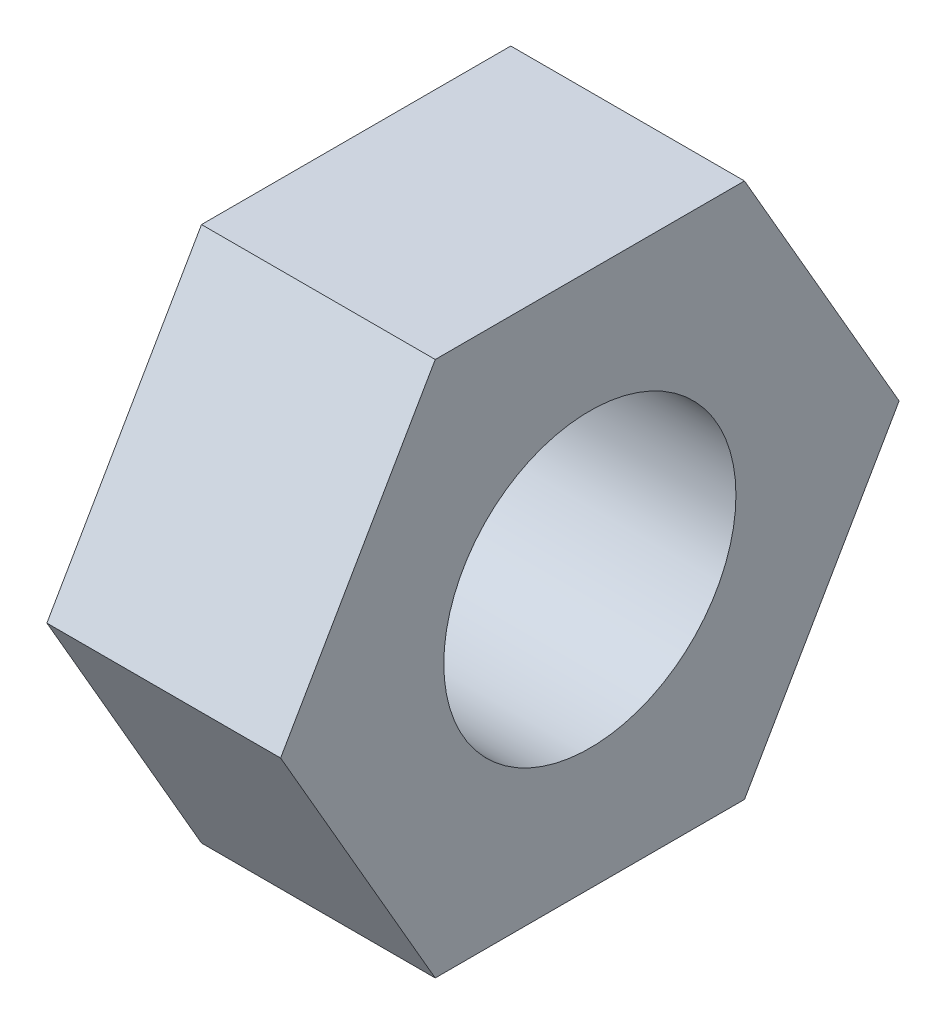
ISO-10303-21;
HEADER;
FILE_DESCRIPTION(('STEP AP214'),'2;1');
FILE_NAME('part.step','',(''),(''),'','','');
FILE_SCHEMA(('AUTOMOTIVE_DESIGN { 1 0 10303 214 1 1 1 1 }'));
ENDSEC;
DATA;
#1=APPLICATION_CONTEXT('core data for automotive mechanical design processes');
#2=APPLICATION_PROTOCOL_DEFINITION('international standard','automotive_design',2000,#1);
#3=PRODUCT_CONTEXT('',#1,'mechanical');
#4=PRODUCT('Part','Part','',(#3));
#5=PRODUCT_RELATED_PRODUCT_CATEGORY('part','',(#4));
#6=PRODUCT_DEFINITION_FORMATION('','',#4);
#7=PRODUCT_DEFINITION_CONTEXT('part definition',#1,'design');
#8=PRODUCT_DEFINITION('design','',#6,#7);
#9=PRODUCT_DEFINITION_SHAPE('','',#8);
#10=(LENGTH_UNIT() NAMED_UNIT(*) SI_UNIT(.MILLI.,.METRE.));
#11=(NAMED_UNIT(*) PLANE_ANGLE_UNIT() SI_UNIT($,.RADIAN.));
#12=(NAMED_UNIT(*) SI_UNIT($,.STERADIAN.) SOLID_ANGLE_UNIT());
#13=UNCERTAINTY_MEASURE_WITH_UNIT(LENGTH_MEASURE(1.E-05),#10,'distance_accuracy_value','');
#14=(GEOMETRIC_REPRESENTATION_CONTEXT(3) GLOBAL_UNCERTAINTY_ASSIGNED_CONTEXT((#13)) GLOBAL_UNIT_ASSIGNED_CONTEXT((#10,
#11,#12)) REPRESENTATION_CONTEXT('',''));
#15=CARTESIAN_POINT('',(0.,0.,0.));
#16=DIRECTION('',(0.,0.,1.));
#17=DIRECTION('',(1.,0.,0.));
#18=AXIS2_PLACEMENT_3D('',#15,#16,#17);
#19=CARTESIAN_POINT('',(2.4,0.,0.));
#20=DIRECTION('',(1.,0.,0.));
#21=DIRECTION('',(0.,0.,-1.));
#22=AXIS2_PLACEMENT_3D('',#19,#20,#21);
#23=PLANE('',#22);
#24=DIRECTION('',(0.,0.866025403784439,-0.5));
#25=VECTOR('',#24,1.);
#26=CARTESIAN_POINT('',(2.4,-2.75,-1.58771324027147));
#27=LINE('',#26,#25);
#28=CARTESIAN_POINT('',(2.4,-2.75,-1.58771324027147));
#29=VERTEX_POINT('',#28);
#30=CARTESIAN_POINT('',(2.4,0.,-3.17542648054294));
#31=VERTEX_POINT('',#30);
#32=EDGE_CURVE('E129',#29,#31,#27,.T.);
#33=ORIENTED_EDGE('',*,*,#32,.T.);
#34=DIRECTION('',(0.,0.866025403784438,0.5));
#35=VECTOR('',#34,1.);
#36=CARTESIAN_POINT('',(2.4,0.,-3.17542648054294));
#37=LINE('',#36,#35);
#38=CARTESIAN_POINT('',(2.4,2.75,-1.58771324027147));
#39=VERTEX_POINT('',#38);
#40=EDGE_CURVE('E87',#31,#39,#37,.T.);
#41=ORIENTED_EDGE('',*,*,#40,.T.);
#42=DIRECTION('',(0.,0.,1.));
#43=VECTOR('',#42,1.);
#44=CARTESIAN_POINT('',(2.4,2.75,-1.58771324027147));
#45=LINE('',#44,#43);
#46=CARTESIAN_POINT('',(2.4,2.75,1.58771324027147));
#47=VERTEX_POINT('',#46);
#48=EDGE_CURVE('E100',#39,#47,#45,.T.);
#49=ORIENTED_EDGE('',*,*,#48,.T.);
#50=DIRECTION('',(0.,-0.866025403784439,0.5));
#51=VECTOR('',#50,1.);
#52=CARTESIAN_POINT('',(2.4,2.75,1.58771324027147));
#53=LINE('',#52,#51);
#54=CARTESIAN_POINT('',(2.4,0.,3.17542648054294));
#55=VERTEX_POINT('',#54);
#56=EDGE_CURVE('E94',#47,#55,#53,.T.);
#57=ORIENTED_EDGE('',*,*,#56,.T.);
#58=DIRECTION('',(0.,-0.866025403784439,-0.5));
#59=VECTOR('',#58,1.);
#60=CARTESIAN_POINT('',(2.4,0.,3.17542648054294));
#61=LINE('',#60,#59);
#62=CARTESIAN_POINT('',(2.4,-2.75,1.58771324027147));
#63=VERTEX_POINT('',#62);
#64=EDGE_CURVE('E98',#55,#63,#61,.T.);
#65=ORIENTED_EDGE('',*,*,#64,.T.);
#66=DIRECTION('',(0.,0.,-1.));
#67=VECTOR('',#66,1.);
#68=CARTESIAN_POINT('',(2.4,-2.75,1.58771324027147));
#69=LINE('',#68,#67);
#70=EDGE_CURVE('E50',#63,#29,#69,.T.);
#71=ORIENTED_EDGE('',*,*,#70,.T.);
#72=EDGE_LOOP('',(#33,#41,#49,#57,#65,#71));
#73=FACE_BOUND('',#72,.T.);
#74=CARTESIAN_POINT('',(2.4,0.,0.));
#75=DIRECTION('',(1.,0.,0.));
#76=DIRECTION('',(0.,0.,-1.));
#77=AXIS2_PLACEMENT_3D('',#74,#75,#76);
#78=CIRCLE('',#77,1.5);
#79=CARTESIAN_POINT('',(2.4,0.,-1.5));
#80=VERTEX_POINT('',#79);
#81=EDGE_CURVE('E122',#80,#80,#78,.T.);
#82=ORIENTED_EDGE('',*,*,#81,.F.);
#83=EDGE_LOOP('',(#82));
#84=FACE_BOUND('',#83,.T.);
#85=ADVANCED_FACE('F33',(#73,#84),#23,.T.);
#86=CARTESIAN_POINT('',(0.,0.,0.));
#87=DIRECTION('',(1.,0.,0.));
#88=DIRECTION('',(0.,0.,-1.));
#89=AXIS2_PLACEMENT_3D('',#86,#87,#88);
#90=PLANE('',#89);
#91=DIRECTION('',(0.,0.866025403784439,-0.5));
#92=VECTOR('',#91,1.);
#93=CARTESIAN_POINT('',(0.,-2.75,-1.58771324027147));
#94=LINE('',#93,#92);
#95=CARTESIAN_POINT('',(0.,-2.75,-1.58771324027147));
#96=VERTEX_POINT('',#95);
#97=CARTESIAN_POINT('',(0.,0.,-3.17542648054294));
#98=VERTEX_POINT('',#97);
#99=EDGE_CURVE('E118',#96,#98,#94,.T.);
#100=ORIENTED_EDGE('',*,*,#99,.F.);
#101=DIRECTION('',(0.,0.,-1.));
#102=VECTOR('',#101,1.);
#103=CARTESIAN_POINT('',(0.,-2.75,1.58771324027147));
#104=LINE('',#103,#102);
#105=CARTESIAN_POINT('',(0.,-2.75,1.58771324027147));
#106=VERTEX_POINT('',#105);
#107=EDGE_CURVE('E79',#106,#96,#104,.T.);
#108=ORIENTED_EDGE('',*,*,#107,.F.);
#109=DIRECTION('',(0.,-0.866025403784439,-0.5));
#110=VECTOR('',#109,1.);
#111=CARTESIAN_POINT('',(0.,0.,3.17542648054294));
#112=LINE('',#111,#110);
#113=CARTESIAN_POINT('',(0.,0.,3.17542648054294));
#114=VERTEX_POINT('',#113);
#115=EDGE_CURVE('E73',#114,#106,#112,.T.);
#116=ORIENTED_EDGE('',*,*,#115,.F.);
#117=DIRECTION('',(0.,-0.866025403784439,0.5));
#118=VECTOR('',#117,1.);
#119=CARTESIAN_POINT('',(0.,2.75,1.58771324027147));
#120=LINE('',#119,#118);
#121=CARTESIAN_POINT('',(0.,2.75,1.58771324027147));
#122=VERTEX_POINT('',#121);
#123=EDGE_CURVE('E108',#122,#114,#120,.T.);
#124=ORIENTED_EDGE('',*,*,#123,.F.);
#125=DIRECTION('',(0.,0.,1.));
#126=VECTOR('',#125,1.);
#127=CARTESIAN_POINT('',(0.,2.75,-1.58771324027147));
#128=LINE('',#127,#126);
#129=CARTESIAN_POINT('',(0.,2.75,-1.58771324027147));
#130=VERTEX_POINT('',#129);
#131=EDGE_CURVE('E124',#130,#122,#128,.T.);
#132=ORIENTED_EDGE('',*,*,#131,.F.);
#133=DIRECTION('',(0.,0.866025403784438,0.5));
#134=VECTOR('',#133,1.);
#135=CARTESIAN_POINT('',(0.,0.,-3.17542648054294));
#136=LINE('',#135,#134);
#137=EDGE_CURVE('E121',#98,#130,#136,.T.);
#138=ORIENTED_EDGE('',*,*,#137,.F.);
#139=EDGE_LOOP('',(#100,#108,#116,#124,#132,#138));
#140=FACE_BOUND('',#139,.T.);
#141=CARTESIAN_POINT('',(0.,0.,0.));
#142=DIRECTION('',(1.,0.,0.));
#143=DIRECTION('',(0.,0.,-1.));
#144=AXIS2_PLACEMENT_3D('',#141,#142,#143);
#145=CIRCLE('',#144,1.5);
#146=CARTESIAN_POINT('',(0.,0.,-1.5));
#147=VERTEX_POINT('',#146);
#148=EDGE_CURVE('E222',#147,#147,#145,.T.);
#149=ORIENTED_EDGE('',*,*,#148,.T.);
#150=EDGE_LOOP('',(#149));
#151=FACE_BOUND('',#150,.T.);
#152=ADVANCED_FACE('F138',(#140,#151),#90,.F.);
#153=CARTESIAN_POINT('',(2.4,-2.75,-1.58771324027147));
#154=DIRECTION('',(0.,0.5,0.866025403784439));
#155=DIRECTION('',(0.,-0.866025403784439,0.5));
#156=AXIS2_PLACEMENT_3D('',#153,#154,#155);
#157=PLANE('',#156);
#158=ORIENTED_EDGE('',*,*,#99,.T.);
#159=DIRECTION('',(-1.,0.,0.));
#160=VECTOR('',#159,1.);
#161=CARTESIAN_POINT('',(2.4,0.,-3.17542648054294));
#162=LINE('',#161,#160);
#163=EDGE_CURVE('E11',#31,#98,#162,.T.);
#164=ORIENTED_EDGE('',*,*,#163,.F.);
#165=ORIENTED_EDGE('',*,*,#32,.F.);
#166=DIRECTION('',(-1.,0.,0.));
#167=VECTOR('',#166,1.);
#168=CARTESIAN_POINT('',(2.4,-2.75,-1.58771324027147));
#169=LINE('',#168,#167);
#170=EDGE_CURVE('E114',#29,#96,#169,.T.);
#171=ORIENTED_EDGE('',*,*,#170,.T.);
#172=EDGE_LOOP('',(#158,#164,#165,#171));
#173=FACE_BOUND('',#172,.T.);
#174=ADVANCED_FACE('F35',(#173),#157,.F.);
#175=CARTESIAN_POINT('',(2.4,0.,-3.17542648054294));
#176=DIRECTION('',(0.,-0.5,0.866025403784439));
#177=DIRECTION('',(0.,-0.866025403784439,-0.5));
#178=AXIS2_PLACEMENT_3D('',#175,#176,#177);
#179=PLANE('',#178);
#180=ORIENTED_EDGE('',*,*,#137,.T.);
#181=DIRECTION('',(-1.,0.,0.));
#182=VECTOR('',#181,1.);
#183=CARTESIAN_POINT('',(2.4,2.75,-1.58771324027147));
#184=LINE('',#183,#182);
#185=EDGE_CURVE('E42',#39,#130,#184,.T.);
#186=ORIENTED_EDGE('',*,*,#185,.F.);
#187=ORIENTED_EDGE('',*,*,#40,.F.);
#188=ORIENTED_EDGE('',*,*,#163,.T.);
#189=EDGE_LOOP('',(#180,#186,#187,#188));
#190=FACE_BOUND('',#189,.T.);
#191=ADVANCED_FACE('F163',(#190),#179,.F.);
#192=CARTESIAN_POINT('',(2.4,2.75,-1.58771324027147));
#193=DIRECTION('',(0.,-1.,0.));
#194=DIRECTION('',(0.,0.,-1.));
#195=AXIS2_PLACEMENT_3D('',#192,#193,#194);
#196=PLANE('',#195);
#197=ORIENTED_EDGE('',*,*,#131,.T.);
#198=DIRECTION('',(-1.,0.,0.));
#199=VECTOR('',#198,1.);
#200=CARTESIAN_POINT('',(2.4,2.75,1.58771324027147));
#201=LINE('',#200,#199);
#202=EDGE_CURVE('E109',#47,#122,#201,.T.);
#203=ORIENTED_EDGE('',*,*,#202,.F.);
#204=ORIENTED_EDGE('',*,*,#48,.F.);
#205=ORIENTED_EDGE('',*,*,#185,.T.);
#206=EDGE_LOOP('',(#197,#203,#204,#205));
#207=FACE_BOUND('',#206,.T.);
#208=ADVANCED_FACE('F135',(#207),#196,.F.);
#209=CARTESIAN_POINT('',(2.4,2.75,1.58771324027147));
#210=DIRECTION('',(0.,-0.5,-0.866025403784439));
#211=DIRECTION('',(0.,0.866025403784439,-0.5));
#212=AXIS2_PLACEMENT_3D('',#209,#210,#211);
#213=PLANE('',#212);
#214=ORIENTED_EDGE('',*,*,#123,.T.);
#215=DIRECTION('',(-1.,0.,0.));
#216=VECTOR('',#215,1.);
#217=CARTESIAN_POINT('',(2.4,0.,3.17542648054294));
#218=LINE('',#217,#216);
#219=EDGE_CURVE('E105',#55,#114,#218,.T.);
#220=ORIENTED_EDGE('',*,*,#219,.F.);
#221=ORIENTED_EDGE('',*,*,#56,.F.);
#222=ORIENTED_EDGE('',*,*,#202,.T.);
#223=EDGE_LOOP('',(#214,#220,#221,#222));
#224=FACE_BOUND('',#223,.T.);
#225=ADVANCED_FACE('F106',(#224),#213,.F.);
#226=CARTESIAN_POINT('',(2.4,0.,3.17542648054294));
#227=DIRECTION('',(0.,0.5,-0.866025403784439));
#228=DIRECTION('',(0.,0.866025403784439,0.5));
#229=AXIS2_PLACEMENT_3D('',#226,#227,#228);
#230=PLANE('',#229);
#231=ORIENTED_EDGE('',*,*,#115,.T.);
#232=DIRECTION('',(-1.,0.,0.));
#233=VECTOR('',#232,1.);
#234=CARTESIAN_POINT('',(2.4,-2.75,1.58771324027147));
#235=LINE('',#234,#233);
#236=EDGE_CURVE('E110',#63,#106,#235,.T.);
#237=ORIENTED_EDGE('',*,*,#236,.F.);
#238=ORIENTED_EDGE('',*,*,#64,.F.);
#239=ORIENTED_EDGE('',*,*,#219,.T.);
#240=EDGE_LOOP('',(#231,#237,#238,#239));
#241=FACE_BOUND('',#240,.T.);
#242=ADVANCED_FACE('F112',(#241),#230,.F.);
#243=CARTESIAN_POINT('',(2.4,-2.75,1.58771324027147));
#244=DIRECTION('',(0.,1.,0.));
#245=DIRECTION('',(0.,0.,1.));
#246=AXIS2_PLACEMENT_3D('',#243,#244,#245);
#247=PLANE('',#246);
#248=ORIENTED_EDGE('',*,*,#107,.T.);
#249=ORIENTED_EDGE('',*,*,#170,.F.);
#250=ORIENTED_EDGE('',*,*,#70,.F.);
#251=ORIENTED_EDGE('',*,*,#236,.T.);
#252=EDGE_LOOP('',(#248,#249,#250,#251));
#253=FACE_BOUND('',#252,.T.);
#254=ADVANCED_FACE('F143',(#253),#247,.F.);
#255=CARTESIAN_POINT('',(2.4,0.,0.));
#256=DIRECTION('',(-1.,0.,0.));
#257=DIRECTION('',(0.,0.,1.));
#258=AXIS2_PLACEMENT_3D('',#255,#256,#257);
#259=CYLINDRICAL_SURFACE('',#258,1.5);
#260=ORIENTED_EDGE('',*,*,#81,.T.);
#261=EDGE_LOOP('',(#260));
#262=FACE_BOUND('',#261,.T.);
#263=ORIENTED_EDGE('',*,*,#148,.F.);
#264=EDGE_LOOP('',(#263));
#265=FACE_BOUND('',#264,.T.);
#266=ADVANCED_FACE('F145',(#262,#265),#259,.F.);
#267=CLOSED_SHELL('',(#85,#152,#174,#191,#208,#225,#242,#254,#266));
#268=MANIFOLD_SOLID_BREP('B2',#267);
#269=ADVANCED_BREP_SHAPE_REPRESENTATION('',(#18,#268),#14);
#270=SHAPE_DEFINITION_REPRESENTATION(#9,#269);
ENDSEC;
END-ISO-10303-21;
